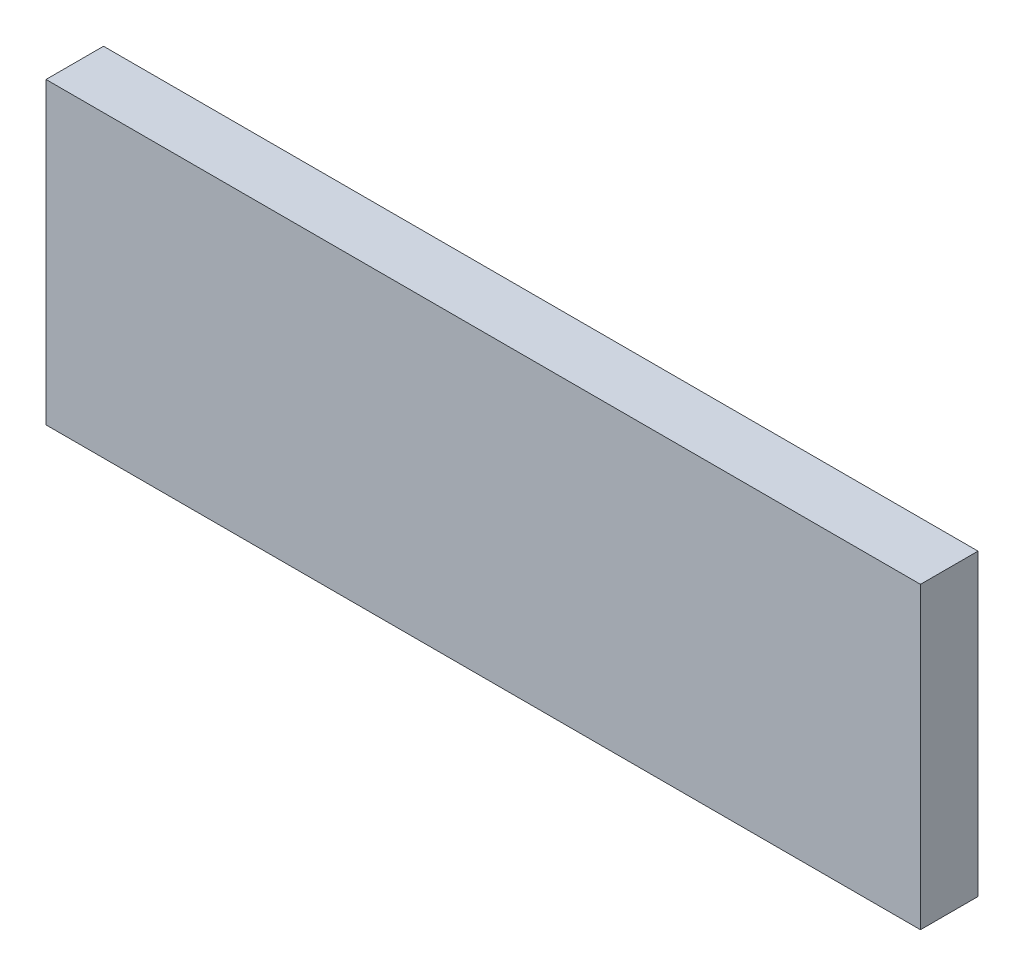
ISO-10303-21;
HEADER;
FILE_DESCRIPTION(('STEP AP214'),'2;1');
FILE_NAME('part.step','',(''),(''),'','','');
FILE_SCHEMA(('AUTOMOTIVE_DESIGN { 1 0 10303 214 1 1 1 1 }'));
ENDSEC;
DATA;
#1=APPLICATION_CONTEXT('core data for automotive mechanical design processes');
#2=APPLICATION_PROTOCOL_DEFINITION('international standard','automotive_design',2000,#1);
#3=PRODUCT_CONTEXT('',#1,'mechanical');
#4=PRODUCT('Part','Part','',(#3));
#5=PRODUCT_RELATED_PRODUCT_CATEGORY('part','',(#4));
#6=PRODUCT_DEFINITION_FORMATION('','',#4);
#7=PRODUCT_DEFINITION_CONTEXT('part definition',#1,'design');
#8=PRODUCT_DEFINITION('design','',#6,#7);
#9=PRODUCT_DEFINITION_SHAPE('','',#8);
#10=(LENGTH_UNIT() NAMED_UNIT(*) SI_UNIT(.MILLI.,.METRE.));
#11=(NAMED_UNIT(*) PLANE_ANGLE_UNIT() SI_UNIT($,.RADIAN.));
#12=(NAMED_UNIT(*) SI_UNIT($,.STERADIAN.) SOLID_ANGLE_UNIT());
#13=UNCERTAINTY_MEASURE_WITH_UNIT(LENGTH_MEASURE(1.E-05),#10,'distance_accuracy_value','');
#14=(GEOMETRIC_REPRESENTATION_CONTEXT(3) GLOBAL_UNCERTAINTY_ASSIGNED_CONTEXT((#13)) GLOBAL_UNIT_ASSIGNED_CONTEXT((#10,
#11,#12)) REPRESENTATION_CONTEXT('',''));
#15=CARTESIAN_POINT('',(0.,0.,0.));
#16=DIRECTION('',(0.,0.,1.));
#17=DIRECTION('',(1.,0.,0.));
#18=AXIS2_PLACEMENT_3D('',#15,#16,#17);
#19=CARTESIAN_POINT('',(152.,-52.0000000000003,19.9999999999999));
#20=DIRECTION('',(-1.,0.,0.));
#21=DIRECTION('',(0.,0.,1.00000000000001));
#22=AXIS2_PLACEMENT_3D('',#19,#20,#21);
#23=PLANE('',#22);
#24=DIRECTION('',(0.,1.00000000000001,0.));
#25=VECTOR('',#24,1.);
#26=CARTESIAN_POINT('',(152.,-52.0000000000006,-6.66133814775094E-13));
#27=LINE('',#26,#25);
#28=CARTESIAN_POINT('',(152.,-52.0000000000006,-6.66133814775094E-13));
#29=VERTEX_POINT('',#28);
#30=CARTESIAN_POINT('',(152.,52.0000000000011,0.));
#31=VERTEX_POINT('',#30);
#32=EDGE_CURVE('E114',#29,#31,#27,.T.);
#33=ORIENTED_EDGE('',*,*,#32,.T.);
#34=DIRECTION('',(0.,0.,-1.00000000000001));
#35=VECTOR('',#34,1.);
#36=CARTESIAN_POINT('',(152.,52.0000000000011,20.));
#37=LINE('',#36,#35);
#38=CARTESIAN_POINT('',(152.,52.0000000000011,20.));
#39=VERTEX_POINT('',#38);
#40=EDGE_CURVE('E11',#39,#31,#37,.T.);
#41=ORIENTED_EDGE('',*,*,#40,.F.);
#42=DIRECTION('',(0.,1.00000000000001,0.));
#43=VECTOR('',#42,1.);
#44=CARTESIAN_POINT('',(152.,-52.0000000000003,19.9999999999999));
#45=LINE('',#44,#43);
#46=CARTESIAN_POINT('',(152.,-52.0000000000003,19.9999999999999));
#47=VERTEX_POINT('',#46);
#48=EDGE_CURVE('E97',#47,#39,#45,.T.);
#49=ORIENTED_EDGE('',*,*,#48,.F.);
#50=DIRECTION('',(0.,0.,-1.00000000000001));
#51=VECTOR('',#50,1.);
#52=CARTESIAN_POINT('',(152.,-52.0000000000003,19.9999999999999));
#53=LINE('',#52,#51);
#54=EDGE_CURVE('E110',#47,#29,#53,.T.);
#55=ORIENTED_EDGE('',*,*,#54,.T.);
#56=EDGE_LOOP('',(#33,#41,#49,#55));
#57=FACE_BOUND('',#56,.T.);
#58=ADVANCED_FACE('F45',(#57),#23,.F.);
#59=CARTESIAN_POINT('',(-152.,52.0000000000011,20.));
#60=DIRECTION('',(0.,-1.00000000000001,0.));
#61=DIRECTION('',(0.,0.,-1.00000000000001));
#62=AXIS2_PLACEMENT_3D('',#59,#60,#61);
#63=PLANE('',#62);
#64=DIRECTION('',(-1.,0.,0.));
#65=VECTOR('',#64,1.);
#66=CARTESIAN_POINT('',(-152.,52.0000000000011,0.));
#67=LINE('',#66,#65);
#68=CARTESIAN_POINT('',(-152.,52.0000000000011,0.));
#69=VERTEX_POINT('',#68);
#70=EDGE_CURVE('E102',#31,#69,#67,.T.);
#71=ORIENTED_EDGE('',*,*,#70,.T.);
#72=DIRECTION('',(0.,0.,-1.00000000000001));
#73=VECTOR('',#72,1.);
#74=CARTESIAN_POINT('',(-152.,52.0000000000011,20.));
#75=LINE('',#74,#73);
#76=CARTESIAN_POINT('',(-152.,52.0000000000011,20.));
#77=VERTEX_POINT('',#76);
#78=EDGE_CURVE('E54',#77,#69,#75,.T.);
#79=ORIENTED_EDGE('',*,*,#78,.F.);
#80=DIRECTION('',(-1.,0.,0.));
#81=VECTOR('',#80,1.);
#82=CARTESIAN_POINT('',(-152.,52.0000000000011,20.));
#83=LINE('',#82,#81);
#84=EDGE_CURVE('E92',#39,#77,#83,.T.);
#85=ORIENTED_EDGE('',*,*,#84,.F.);
#86=ORIENTED_EDGE('',*,*,#40,.T.);
#87=EDGE_LOOP('',(#71,#79,#85,#86));
#88=FACE_BOUND('',#87,.T.);
#89=ADVANCED_FACE('F101',(#88),#63,.F.);
#90=CARTESIAN_POINT('',(-152.,-52.0000000000003,19.9999999999999));
#91=DIRECTION('',(1.,0.,0.));
#92=DIRECTION('',(0.,0.,-1.00000000000001));
#93=AXIS2_PLACEMENT_3D('',#90,#91,#92);
#94=PLANE('',#93);
#95=DIRECTION('',(0.,-1.00000000000001,0.));
#96=VECTOR('',#95,1.);
#97=CARTESIAN_POINT('',(-152.,-52.0000000000006,-6.66133814775094E-13));
#98=LINE('',#97,#96);
#99=CARTESIAN_POINT('',(-152.,-52.0000000000006,-6.66133814775094E-13));
#100=VERTEX_POINT('',#99);
#101=EDGE_CURVE('E79',#69,#100,#98,.T.);
#102=ORIENTED_EDGE('',*,*,#101,.T.);
#103=DIRECTION('',(0.,0.,-1.00000000000001));
#104=VECTOR('',#103,1.);
#105=CARTESIAN_POINT('',(-152.,-52.0000000000003,19.9999999999999));
#106=LINE('',#105,#104);
#107=CARTESIAN_POINT('',(-152.,-52.0000000000003,19.9999999999999));
#108=VERTEX_POINT('',#107);
#109=EDGE_CURVE('E104',#108,#100,#106,.T.);
#110=ORIENTED_EDGE('',*,*,#109,.F.);
#111=DIRECTION('',(0.,-1.00000000000001,0.));
#112=VECTOR('',#111,1.);
#113=CARTESIAN_POINT('',(-152.,-52.0000000000003,19.9999999999999));
#114=LINE('',#113,#112);
#115=EDGE_CURVE('E95',#77,#108,#114,.T.);
#116=ORIENTED_EDGE('',*,*,#115,.F.);
#117=ORIENTED_EDGE('',*,*,#78,.T.);
#118=EDGE_LOOP('',(#102,#110,#116,#117));
#119=FACE_BOUND('',#118,.T.);
#120=ADVANCED_FACE('F105',(#119),#94,.F.);
#121=CARTESIAN_POINT('',(-152.,-52.0000000000003,19.9999999999999));
#122=DIRECTION('',(0.,1.00000000000001,0.));
#123=DIRECTION('',(0.,0.,1.00000000000001));
#124=AXIS2_PLACEMENT_3D('',#121,#122,#123);
#125=PLANE('',#124);
#126=DIRECTION('',(1.,0.,0.));
#127=VECTOR('',#126,1.);
#128=CARTESIAN_POINT('',(-152.,-52.0000000000006,-6.66133814775094E-13));
#129=LINE('',#128,#127);
#130=EDGE_CURVE('E85',#100,#29,#129,.T.);
#131=ORIENTED_EDGE('',*,*,#130,.T.);
#132=ORIENTED_EDGE('',*,*,#54,.F.);
#133=DIRECTION('',(1.,0.,0.));
#134=VECTOR('',#133,1.);
#135=CARTESIAN_POINT('',(-152.,-52.0000000000003,19.9999999999999));
#136=LINE('',#135,#134);
#137=EDGE_CURVE('E62',#108,#47,#136,.T.);
#138=ORIENTED_EDGE('',*,*,#137,.F.);
#139=ORIENTED_EDGE('',*,*,#109,.T.);
#140=EDGE_LOOP('',(#131,#132,#138,#139));
#141=FACE_BOUND('',#140,.T.);
#142=ADVANCED_FACE('F128',(#141),#125,.F.);
#143=CARTESIAN_POINT('',(0.,0.,20.));
#144=DIRECTION('',(0.,0.,-1.00000000000001));
#145=DIRECTION('',(-1.,0.,0.));
#146=AXIS2_PLACEMENT_3D('',#143,#144,#145);
#147=PLANE('',#146);
#148=ORIENTED_EDGE('',*,*,#48,.T.);
#149=ORIENTED_EDGE('',*,*,#84,.T.);
#150=ORIENTED_EDGE('',*,*,#115,.T.);
#151=ORIENTED_EDGE('',*,*,#137,.T.);
#152=EDGE_LOOP('',(#148,#149,#150,#151));
#153=FACE_BOUND('',#152,.T.);
#154=ADVANCED_FACE('F93',(#153),#147,.F.);
#155=CARTESIAN_POINT('',(0.,0.,0.));
#156=DIRECTION('',(0.,0.,-1.00000000000001));
#157=DIRECTION('',(-1.,0.,0.));
#158=AXIS2_PLACEMENT_3D('',#155,#156,#157);
#159=PLANE('',#158);
#160=ORIENTED_EDGE('',*,*,#32,.F.);
#161=ORIENTED_EDGE('',*,*,#130,.F.);
#162=ORIENTED_EDGE('',*,*,#101,.F.);
#163=ORIENTED_EDGE('',*,*,#70,.F.);
#164=EDGE_LOOP('',(#160,#161,#162,#163));
#165=FACE_BOUND('',#164,.T.);
#166=ADVANCED_FACE('F131',(#165),#159,.T.);
#167=CLOSED_SHELL('',(#58,#89,#120,#142,#154,#166));
#168=MANIFOLD_SOLID_BREP('B2',#167);
#169=ADVANCED_BREP_SHAPE_REPRESENTATION('',(#18,#168),#14);
#170=SHAPE_DEFINITION_REPRESENTATION(#9,#169);
ENDSEC;
END-ISO-10303-21;
